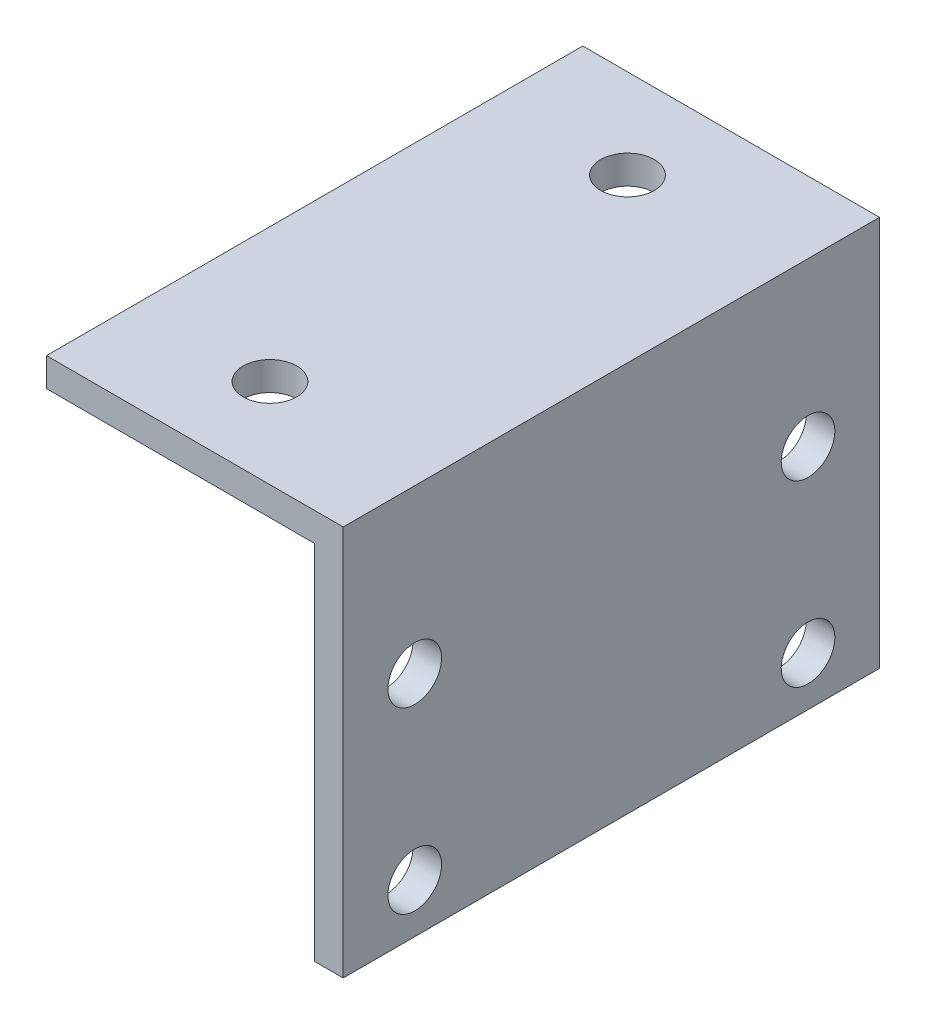
ISO-10303-21;
HEADER;
FILE_DESCRIPTION(('STEP AP214'),'2;1');
FILE_NAME('part.step','',(''),(''),'','','');
FILE_SCHEMA(('AUTOMOTIVE_DESIGN { 1 0 10303 214 1 1 1 1 }'));
ENDSEC;
DATA;
#1=APPLICATION_CONTEXT('core data for automotive mechanical design processes');
#2=APPLICATION_PROTOCOL_DEFINITION('international standard','automotive_design',2000,#1);
#3=PRODUCT_CONTEXT('',#1,'mechanical');
#4=PRODUCT('Part','Part','',(#3));
#5=PRODUCT_RELATED_PRODUCT_CATEGORY('part','',(#4));
#6=PRODUCT_DEFINITION_FORMATION('','',#4);
#7=PRODUCT_DEFINITION_CONTEXT('part definition',#1,'design');
#8=PRODUCT_DEFINITION('design','',#6,#7);
#9=PRODUCT_DEFINITION_SHAPE('','',#8);
#10=(LENGTH_UNIT() NAMED_UNIT(*) SI_UNIT(.MILLI.,.METRE.));
#11=(NAMED_UNIT(*) PLANE_ANGLE_UNIT() SI_UNIT($,.RADIAN.));
#12=(NAMED_UNIT(*) SI_UNIT($,.STERADIAN.) SOLID_ANGLE_UNIT());
#13=UNCERTAINTY_MEASURE_WITH_UNIT(LENGTH_MEASURE(1.E-05),#10,'distance_accuracy_value','');
#14=(GEOMETRIC_REPRESENTATION_CONTEXT(3) GLOBAL_UNCERTAINTY_ASSIGNED_CONTEXT((#13)) GLOBAL_UNIT_ASSIGNED_CONTEXT((#10,
#11,#12)) REPRESENTATION_CONTEXT('',''));
#15=CARTESIAN_POINT('',(0.,0.,0.));
#16=DIRECTION('',(0.,0.,1.));
#17=DIRECTION('',(1.,0.,0.));
#18=AXIS2_PLACEMENT_3D('',#15,#16,#17);
#19=CARTESIAN_POINT('',(0.,-23.4,30.));
#20=DIRECTION('',(1.,0.,0.));
#21=DIRECTION('',(0.,1.,0.));
#22=AXIS2_PLACEMENT_3D('',#19,#20,#21);
#23=PLANE('',#22);
#24=CARTESIAN_POINT('',(0.,-7.5,26.));
#25=DIRECTION('',(-1.,0.,0.));
#26=DIRECTION('',(0.,-1.,0.));
#27=AXIS2_PLACEMENT_3D('',#24,#25,#26);
#28=CIRCLE('',#27,1.5);
#29=CARTESIAN_POINT('',(0.,-9.00000000000001,26.));
#30=VERTEX_POINT('',#29);
#31=EDGE_CURVE('E127',#30,#30,#28,.T.);
#32=ORIENTED_EDGE('',*,*,#31,.F.);
#33=EDGE_LOOP('',(#32));
#34=FACE_BOUND('',#33,.T.);
#35=CARTESIAN_POINT('',(0.,-17.5,4.));
#36=DIRECTION('',(-1.,0.,0.));
#37=DIRECTION('',(0.,-1.,0.));
#38=AXIS2_PLACEMENT_3D('',#35,#36,#37);
#39=CIRCLE('',#38,1.5);
#40=CARTESIAN_POINT('',(0.,-19.,4.));
#41=VERTEX_POINT('',#40);
#42=EDGE_CURVE('E159',#41,#41,#39,.T.);
#43=ORIENTED_EDGE('',*,*,#42,.F.);
#44=EDGE_LOOP('',(#43));
#45=FACE_BOUND('',#44,.T.);
#46=CARTESIAN_POINT('',(0.,-17.5,26.));
#47=DIRECTION('',(-1.,0.,0.));
#48=DIRECTION('',(0.,-1.,0.));
#49=AXIS2_PLACEMENT_3D('',#46,#47,#48);
#50=CIRCLE('',#49,1.5);
#51=CARTESIAN_POINT('',(0.,-19.,26.));
#52=VERTEX_POINT('',#51);
#53=EDGE_CURVE('E156',#52,#52,#50,.T.);
#54=ORIENTED_EDGE('',*,*,#53,.F.);
#55=EDGE_LOOP('',(#54));
#56=FACE_BOUND('',#55,.T.);
#57=CARTESIAN_POINT('',(0.,-7.5,4.));
#58=DIRECTION('',(-1.,0.,0.));
#59=DIRECTION('',(0.,-1.,0.));
#60=AXIS2_PLACEMENT_3D('',#57,#58,#59);
#61=CIRCLE('',#60,1.5);
#62=CARTESIAN_POINT('',(0.,-9.,4.));
#63=VERTEX_POINT('',#62);
#64=EDGE_CURVE('E122',#63,#63,#61,.T.);
#65=ORIENTED_EDGE('',*,*,#64,.F.);
#66=EDGE_LOOP('',(#65));
#67=FACE_BOUND('',#66,.T.);
#68=DIRECTION('',(0.,-1.,0.));
#69=VECTOR('',#68,1.);
#70=CARTESIAN_POINT('',(0.,-23.4,0.));
#71=LINE('',#70,#69);
#72=CARTESIAN_POINT('',(0.,0.,0.));
#73=VERTEX_POINT('',#72);
#74=CARTESIAN_POINT('',(0.,-20.25,0.));
#75=VERTEX_POINT('',#74);
#76=EDGE_CURVE('E102',#73,#75,#71,.T.);
#77=ORIENTED_EDGE('',*,*,#76,.T.);
#78=DIRECTION('',(0.,0.,-1.));
#79=VECTOR('',#78,1.);
#80=CARTESIAN_POINT('',(0.,-20.25,0.));
#81=LINE('',#80,#79);
#82=CARTESIAN_POINT('',(0.,-20.25,30.));
#83=VERTEX_POINT('',#82);
#84=EDGE_CURVE('E55',#83,#75,#81,.T.);
#85=ORIENTED_EDGE('',*,*,#84,.F.);
#86=DIRECTION('',(0.,-1.,0.));
#87=VECTOR('',#86,1.);
#88=CARTESIAN_POINT('',(0.,-23.4,30.));
#89=LINE('',#88,#87);
#90=CARTESIAN_POINT('',(0.,0.,30.));
#91=VERTEX_POINT('',#90);
#92=EDGE_CURVE('E103',#91,#83,#89,.T.);
#93=ORIENTED_EDGE('',*,*,#92,.F.);
#94=DIRECTION('',(0.,0.,-1.));
#95=VECTOR('',#94,1.);
#96=CARTESIAN_POINT('',(0.,0.,30.));
#97=LINE('',#96,#95);
#98=EDGE_CURVE('E113',#91,#73,#97,.T.);
#99=ORIENTED_EDGE('',*,*,#98,.T.);
#100=EDGE_LOOP('',(#77,#85,#93,#99));
#101=FACE_BOUND('',#100,.T.);
#102=ADVANCED_FACE('F34',(#34,#45,#56,#67,#101),#23,.F.);
#103=CARTESIAN_POINT('',(1.6,1.6,30.));
#104=DIRECTION('',(-1.,0.,0.));
#105=DIRECTION('',(0.,-1.,0.));
#106=AXIS2_PLACEMENT_3D('',#103,#104,#105);
#107=PLANE('',#106);
#108=CARTESIAN_POINT('',(1.6,-7.5,26.));
#109=DIRECTION('',(-1.,0.,0.));
#110=DIRECTION('',(0.,-1.,0.));
#111=AXIS2_PLACEMENT_3D('',#108,#109,#110);
#112=CIRCLE('',#111,1.5);
#113=CARTESIAN_POINT('',(1.6,-9.00000000000001,26.));
#114=VERTEX_POINT('',#113);
#115=EDGE_CURVE('E130',#114,#114,#112,.T.);
#116=ORIENTED_EDGE('',*,*,#115,.T.);
#117=EDGE_LOOP('',(#116));
#118=FACE_BOUND('',#117,.T.);
#119=CARTESIAN_POINT('',(1.6,-17.5,4.));
#120=DIRECTION('',(-1.,0.,0.));
#121=DIRECTION('',(0.,-1.,0.));
#122=AXIS2_PLACEMENT_3D('',#119,#120,#121);
#123=CIRCLE('',#122,1.5);
#124=CARTESIAN_POINT('',(1.6,-19.,4.));
#125=VERTEX_POINT('',#124);
#126=EDGE_CURVE('E126',#125,#125,#123,.T.);
#127=ORIENTED_EDGE('',*,*,#126,.T.);
#128=EDGE_LOOP('',(#127));
#129=FACE_BOUND('',#128,.T.);
#130=CARTESIAN_POINT('',(1.6,-17.5,26.));
#131=DIRECTION('',(-1.,0.,0.));
#132=DIRECTION('',(0.,-1.,0.));
#133=AXIS2_PLACEMENT_3D('',#130,#131,#132);
#134=CIRCLE('',#133,1.5);
#135=CARTESIAN_POINT('',(1.6,-19.,26.));
#136=VERTEX_POINT('',#135);
#137=EDGE_CURVE('E123',#136,#136,#134,.T.);
#138=ORIENTED_EDGE('',*,*,#137,.T.);
#139=EDGE_LOOP('',(#138));
#140=FACE_BOUND('',#139,.T.);
#141=CARTESIAN_POINT('',(1.6,-7.5,4.));
#142=DIRECTION('',(-1.,0.,0.));
#143=DIRECTION('',(0.,-1.,0.));
#144=AXIS2_PLACEMENT_3D('',#141,#142,#143);
#145=CIRCLE('',#144,1.5);
#146=CARTESIAN_POINT('',(1.6,-9.,4.));
#147=VERTEX_POINT('',#146);
#148=EDGE_CURVE('E118',#147,#147,#145,.T.);
#149=ORIENTED_EDGE('',*,*,#148,.T.);
#150=EDGE_LOOP('',(#149));
#151=FACE_BOUND('',#150,.T.);
#152=DIRECTION('',(0.,1.,0.));
#153=VECTOR('',#152,1.);
#154=CARTESIAN_POINT('',(1.6,1.6,30.));
#155=LINE('',#154,#153);
#156=CARTESIAN_POINT('',(1.6,-20.25,30.));
#157=VERTEX_POINT('',#156);
#158=CARTESIAN_POINT('',(1.6,1.6,30.));
#159=VERTEX_POINT('',#158);
#160=EDGE_CURVE('E107',#157,#159,#155,.T.);
#161=ORIENTED_EDGE('',*,*,#160,.F.);
#162=DIRECTION('',(0.,0.,-1.));
#163=VECTOR('',#162,1.);
#164=CARTESIAN_POINT('',(1.6,-20.25,30.));
#165=LINE('',#164,#163);
#166=CARTESIAN_POINT('',(1.6,-20.25,0.));
#167=VERTEX_POINT('',#166);
#168=EDGE_CURVE('E160',#157,#167,#165,.T.);
#169=ORIENTED_EDGE('',*,*,#168,.T.);
#170=DIRECTION('',(0.,1.,0.));
#171=VECTOR('',#170,1.);
#172=CARTESIAN_POINT('',(1.6,1.6,0.));
#173=LINE('',#172,#171);
#174=CARTESIAN_POINT('',(1.6,1.6,0.));
#175=VERTEX_POINT('',#174);
#176=EDGE_CURVE('E109',#167,#175,#173,.T.);
#177=ORIENTED_EDGE('',*,*,#176,.T.);
#178=DIRECTION('',(0.,0.,-1.));
#179=VECTOR('',#178,1.);
#180=CARTESIAN_POINT('',(1.6,1.6,30.));
#181=LINE('',#180,#179);
#182=EDGE_CURVE('E115',#159,#175,#181,.T.);
#183=ORIENTED_EDGE('',*,*,#182,.F.);
#184=EDGE_LOOP('',(#161,#169,#177,#183));
#185=FACE_BOUND('',#184,.T.);
#186=ADVANCED_FACE('F178',(#118,#129,#140,#151,#185),#107,.F.);
#187=CARTESIAN_POINT('',(-23.4,1.6,30.));
#188=DIRECTION('',(0.,-1.,0.));
#189=DIRECTION('',(1.,0.,0.));
#190=AXIS2_PLACEMENT_3D('',#187,#188,#189);
#191=PLANE('',#190);
#192=CARTESIAN_POINT('',(-7.5,1.6,25.));
#193=DIRECTION('',(0.,-1.,0.));
#194=DIRECTION('',(1.,0.,0.));
#195=AXIS2_PLACEMENT_3D('',#192,#193,#194);
#196=CIRCLE('',#195,1.5);
#197=CARTESIAN_POINT('',(-6.,1.6,25.));
#198=VERTEX_POINT('',#197);
#199=EDGE_CURVE('E149',#198,#198,#196,.T.);
#200=ORIENTED_EDGE('',*,*,#199,.T.);
#201=EDGE_LOOP('',(#200));
#202=FACE_BOUND('',#201,.T.);
#203=CARTESIAN_POINT('',(-7.5,1.6,5.));
#204=DIRECTION('',(0.,-1.,0.));
#205=DIRECTION('',(1.,0.,0.));
#206=AXIS2_PLACEMENT_3D('',#203,#204,#205);
#207=CIRCLE('',#206,1.5);
#208=CARTESIAN_POINT('',(-6.,1.6,5.));
#209=VERTEX_POINT('',#208);
#210=EDGE_CURVE('E136',#209,#209,#207,.T.);
#211=ORIENTED_EDGE('',*,*,#210,.T.);
#212=EDGE_LOOP('',(#211));
#213=FACE_BOUND('',#212,.T.);
#214=DIRECTION('',(-1.,0.,0.));
#215=VECTOR('',#214,1.);
#216=CARTESIAN_POINT('',(-23.4,1.6,0.));
#217=LINE('',#216,#215);
#218=CARTESIAN_POINT('',(-15.,1.6,0.));
#219=VERTEX_POINT('',#218);
#220=EDGE_CURVE('E104',#175,#219,#217,.T.);
#221=ORIENTED_EDGE('',*,*,#220,.T.);
#222=DIRECTION('',(0.,0.,1.));
#223=VECTOR('',#222,1.);
#224=CARTESIAN_POINT('',(-15.,1.6,30.));
#225=LINE('',#224,#223);
#226=CARTESIAN_POINT('',(-15.,1.6,30.));
#227=VERTEX_POINT('',#226);
#228=EDGE_CURVE('E48',#219,#227,#225,.T.);
#229=ORIENTED_EDGE('',*,*,#228,.T.);
#230=DIRECTION('',(-1.,0.,0.));
#231=VECTOR('',#230,1.);
#232=CARTESIAN_POINT('',(-23.4,1.6,30.));
#233=LINE('',#232,#231);
#234=EDGE_CURVE('E143',#159,#227,#233,.T.);
#235=ORIENTED_EDGE('',*,*,#234,.F.);
#236=ORIENTED_EDGE('',*,*,#182,.T.);
#237=EDGE_LOOP('',(#221,#229,#235,#236));
#238=FACE_BOUND('',#237,.T.);
#239=ADVANCED_FACE('F174',(#202,#213,#238),#191,.F.);
#240=CARTESIAN_POINT('',(0.,0.,30.));
#241=DIRECTION('',(0.,1.,0.));
#242=DIRECTION('',(-1.,0.,0.));
#243=AXIS2_PLACEMENT_3D('',#240,#241,#242);
#244=PLANE('',#243);
#245=CARTESIAN_POINT('',(-7.5,0.,25.));
#246=DIRECTION('',(0.,-1.,0.));
#247=DIRECTION('',(1.,0.,0.));
#248=AXIS2_PLACEMENT_3D('',#245,#246,#247);
#249=CIRCLE('',#248,1.5);
#250=CARTESIAN_POINT('',(-6.,0.,25.));
#251=VERTEX_POINT('',#250);
#252=EDGE_CURVE('E121',#251,#251,#249,.T.);
#253=ORIENTED_EDGE('',*,*,#252,.F.);
#254=EDGE_LOOP('',(#253));
#255=FACE_BOUND('',#254,.T.);
#256=CARTESIAN_POINT('',(-7.5,0.,5.));
#257=DIRECTION('',(0.,-1.,0.));
#258=DIRECTION('',(1.,0.,0.));
#259=AXIS2_PLACEMENT_3D('',#256,#257,#258);
#260=CIRCLE('',#259,1.5);
#261=CARTESIAN_POINT('',(-6.,0.,5.));
#262=VERTEX_POINT('',#261);
#263=EDGE_CURVE('E139',#262,#262,#260,.T.);
#264=ORIENTED_EDGE('',*,*,#263,.F.);
#265=EDGE_LOOP('',(#264));
#266=FACE_BOUND('',#265,.T.);
#267=DIRECTION('',(1.,0.,0.));
#268=VECTOR('',#267,1.);
#269=CARTESIAN_POINT('',(0.,0.,30.));
#270=LINE('',#269,#268);
#271=CARTESIAN_POINT('',(-15.,0.,30.));
#272=VERTEX_POINT('',#271);
#273=EDGE_CURVE('E96',#272,#91,#270,.T.);
#274=ORIENTED_EDGE('',*,*,#273,.F.);
#275=DIRECTION('',(0.,0.,1.));
#276=VECTOR('',#275,1.);
#277=CARTESIAN_POINT('',(-15.,0.,30.));
#278=LINE('',#277,#276);
#279=CARTESIAN_POINT('',(-15.,0.,0.));
#280=VERTEX_POINT('',#279);
#281=EDGE_CURVE('E84',#280,#272,#278,.T.);
#282=ORIENTED_EDGE('',*,*,#281,.F.);
#283=DIRECTION('',(1.,0.,0.));
#284=VECTOR('',#283,1.);
#285=CARTESIAN_POINT('',(0.,0.,0.));
#286=LINE('',#285,#284);
#287=EDGE_CURVE('E94',#280,#73,#286,.T.);
#288=ORIENTED_EDGE('',*,*,#287,.T.);
#289=ORIENTED_EDGE('',*,*,#98,.F.);
#290=EDGE_LOOP('',(#274,#282,#288,#289));
#291=FACE_BOUND('',#290,.T.);
#292=ADVANCED_FACE('F92',(#255,#266,#291),#244,.F.);
#293=CARTESIAN_POINT('',(0.,0.,30.));
#294=DIRECTION('',(0.,0.,1.));
#295=DIRECTION('',(1.,0.,0.));
#296=AXIS2_PLACEMENT_3D('',#293,#294,#295);
#297=PLANE('',#296);
#298=DIRECTION('',(0.,-1.,0.));
#299=VECTOR('',#298,1.);
#300=CARTESIAN_POINT('',(-15.,50.,30.));
#301=LINE('',#300,#299);
#302=EDGE_CURVE('E97',#227,#272,#301,.T.);
#303=ORIENTED_EDGE('',*,*,#302,.T.);
#304=ORIENTED_EDGE('',*,*,#273,.T.);
#305=ORIENTED_EDGE('',*,*,#92,.T.);
#306=DIRECTION('',(-1.,0.,0.));
#307=VECTOR('',#306,1.);
#308=CARTESIAN_POINT('',(50.,-20.25,30.));
#309=LINE('',#308,#307);
#310=EDGE_CURVE('E166',#157,#83,#309,.T.);
#311=ORIENTED_EDGE('',*,*,#310,.F.);
#312=ORIENTED_EDGE('',*,*,#160,.T.);
#313=ORIENTED_EDGE('',*,*,#234,.T.);
#314=EDGE_LOOP('',(#303,#304,#305,#311,#312,#313));
#315=FACE_BOUND('',#314,.T.);
#316=ADVANCED_FACE('F171',(#315),#297,.T.);
#317=CARTESIAN_POINT('',(0.,0.,0.));
#318=DIRECTION('',(0.,0.,1.));
#319=DIRECTION('',(1.,0.,0.));
#320=AXIS2_PLACEMENT_3D('',#317,#318,#319);
#321=PLANE('',#320);
#322=ORIENTED_EDGE('',*,*,#287,.F.);
#323=DIRECTION('',(0.,1.,0.));
#324=VECTOR('',#323,1.);
#325=CARTESIAN_POINT('',(-15.,0.,0.));
#326=LINE('',#325,#324);
#327=EDGE_CURVE('E11',#280,#219,#326,.T.);
#328=ORIENTED_EDGE('',*,*,#327,.T.);
#329=ORIENTED_EDGE('',*,*,#220,.F.);
#330=ORIENTED_EDGE('',*,*,#176,.F.);
#331=DIRECTION('',(-1.,0.,0.));
#332=VECTOR('',#331,1.);
#333=CARTESIAN_POINT('',(0.,-20.25,0.));
#334=LINE('',#333,#332);
#335=EDGE_CURVE('E41',#167,#75,#334,.T.);
#336=ORIENTED_EDGE('',*,*,#335,.T.);
#337=ORIENTED_EDGE('',*,*,#76,.F.);
#338=EDGE_LOOP('',(#322,#328,#329,#330,#336,#337));
#339=FACE_BOUND('',#338,.T.);
#340=ADVANCED_FACE('F100',(#339),#321,.F.);
#341=CARTESIAN_POINT('',(-7.50000000000001,50.,5.));
#342=DIRECTION('',(0.,-1.,0.));
#343=DIRECTION('',(1.,0.,0.));
#344=AXIS2_PLACEMENT_3D('',#341,#342,#343);
#345=CYLINDRICAL_SURFACE('',#344,1.5);
#346=ORIENTED_EDGE('',*,*,#263,.T.);
#347=EDGE_LOOP('',(#346));
#348=FACE_BOUND('',#347,.T.);
#349=ORIENTED_EDGE('',*,*,#210,.F.);
#350=EDGE_LOOP('',(#349));
#351=FACE_BOUND('',#350,.T.);
#352=ADVANCED_FACE('F220',(#348,#351),#345,.F.);
#353=CARTESIAN_POINT('',(-7.50000000000001,50.,25.));
#354=DIRECTION('',(0.,-1.,0.));
#355=DIRECTION('',(1.,0.,0.));
#356=AXIS2_PLACEMENT_3D('',#353,#354,#355);
#357=CYLINDRICAL_SURFACE('',#356,1.5);
#358=ORIENTED_EDGE('',*,*,#252,.T.);
#359=EDGE_LOOP('',(#358));
#360=FACE_BOUND('',#359,.T.);
#361=ORIENTED_EDGE('',*,*,#199,.F.);
#362=EDGE_LOOP('',(#361));
#363=FACE_BOUND('',#362,.T.);
#364=ADVANCED_FACE('F210',(#360,#363),#357,.F.);
#365=CARTESIAN_POINT('',(50.,-7.5,4.));
#366=DIRECTION('',(-1.,0.,0.));
#367=DIRECTION('',(0.,-1.,0.));
#368=AXIS2_PLACEMENT_3D('',#365,#366,#367);
#369=CYLINDRICAL_SURFACE('',#368,1.5);
#370=ORIENTED_EDGE('',*,*,#64,.T.);
#371=EDGE_LOOP('',(#370));
#372=FACE_BOUND('',#371,.T.);
#373=ORIENTED_EDGE('',*,*,#148,.F.);
#374=EDGE_LOOP('',(#373));
#375=FACE_BOUND('',#374,.T.);
#376=ADVANCED_FACE('F206',(#372,#375),#369,.F.);
#377=CARTESIAN_POINT('',(50.,-17.5,26.));
#378=DIRECTION('',(-1.,0.,0.));
#379=DIRECTION('',(0.,-1.,0.));
#380=AXIS2_PLACEMENT_3D('',#377,#378,#379);
#381=CYLINDRICAL_SURFACE('',#380,1.5);
#382=ORIENTED_EDGE('',*,*,#53,.T.);
#383=EDGE_LOOP('',(#382));
#384=FACE_BOUND('',#383,.T.);
#385=ORIENTED_EDGE('',*,*,#137,.F.);
#386=EDGE_LOOP('',(#385));
#387=FACE_BOUND('',#386,.T.);
#388=ADVANCED_FACE('F209',(#384,#387),#381,.F.);
#389=CARTESIAN_POINT('',(50.,-17.5,4.));
#390=DIRECTION('',(-1.,0.,0.));
#391=DIRECTION('',(0.,-1.,0.));
#392=AXIS2_PLACEMENT_3D('',#389,#390,#391);
#393=CYLINDRICAL_SURFACE('',#392,1.5);
#394=ORIENTED_EDGE('',*,*,#42,.T.);
#395=EDGE_LOOP('',(#394));
#396=FACE_BOUND('',#395,.T.);
#397=ORIENTED_EDGE('',*,*,#126,.F.);
#398=EDGE_LOOP('',(#397));
#399=FACE_BOUND('',#398,.T.);
#400=ADVANCED_FACE('F189',(#396,#399),#393,.F.);
#401=CARTESIAN_POINT('',(50.,-7.5,26.));
#402=DIRECTION('',(-1.,0.,0.));
#403=DIRECTION('',(0.,-1.,0.));
#404=AXIS2_PLACEMENT_3D('',#401,#402,#403);
#405=CYLINDRICAL_SURFACE('',#404,1.5);
#406=ORIENTED_EDGE('',*,*,#31,.T.);
#407=EDGE_LOOP('',(#406));
#408=FACE_BOUND('',#407,.T.);
#409=ORIENTED_EDGE('',*,*,#115,.F.);
#410=EDGE_LOOP('',(#409));
#411=FACE_BOUND('',#410,.T.);
#412=ADVANCED_FACE('F182',(#408,#411),#405,.F.);
#413=CARTESIAN_POINT('',(50.,-20.25,0.));
#414=DIRECTION('',(0.,1.,0.));
#415=DIRECTION('',(-1.,0.,0.));
#416=AXIS2_PLACEMENT_3D('',#413,#414,#415);
#417=PLANE('',#416);
#418=ORIENTED_EDGE('',*,*,#310,.T.);
#419=ORIENTED_EDGE('',*,*,#84,.T.);
#420=ORIENTED_EDGE('',*,*,#335,.F.);
#421=ORIENTED_EDGE('',*,*,#168,.F.);
#422=EDGE_LOOP('',(#418,#419,#420,#421));
#423=FACE_BOUND('',#422,.T.);
#424=ADVANCED_FACE('F180',(#423),#417,.F.);
#425=CARTESIAN_POINT('',(-15.,50.,30.));
#426=DIRECTION('',(1.,0.,0.));
#427=DIRECTION('',(0.,0.,-1.));
#428=AXIS2_PLACEMENT_3D('',#425,#426,#427);
#429=PLANE('',#428);
#430=ORIENTED_EDGE('',*,*,#327,.F.);
#431=ORIENTED_EDGE('',*,*,#281,.T.);
#432=ORIENTED_EDGE('',*,*,#302,.F.);
#433=ORIENTED_EDGE('',*,*,#228,.F.);
#434=EDGE_LOOP('',(#430,#431,#432,#433));
#435=FACE_BOUND('',#434,.T.);
#436=ADVANCED_FACE('F83',(#435),#429,.F.);
#437=CLOSED_SHELL('',(#102,#186,#239,#292,#316,#340,#352,#364,#376,#388,#400,#412,#424,#436));
#438=MANIFOLD_SOLID_BREP('B2',#437);
#439=ADVANCED_BREP_SHAPE_REPRESENTATION('',(#18,#438),#14);
#440=SHAPE_DEFINITION_REPRESENTATION(#9,#439);
ENDSEC;
END-ISO-10303-21;
